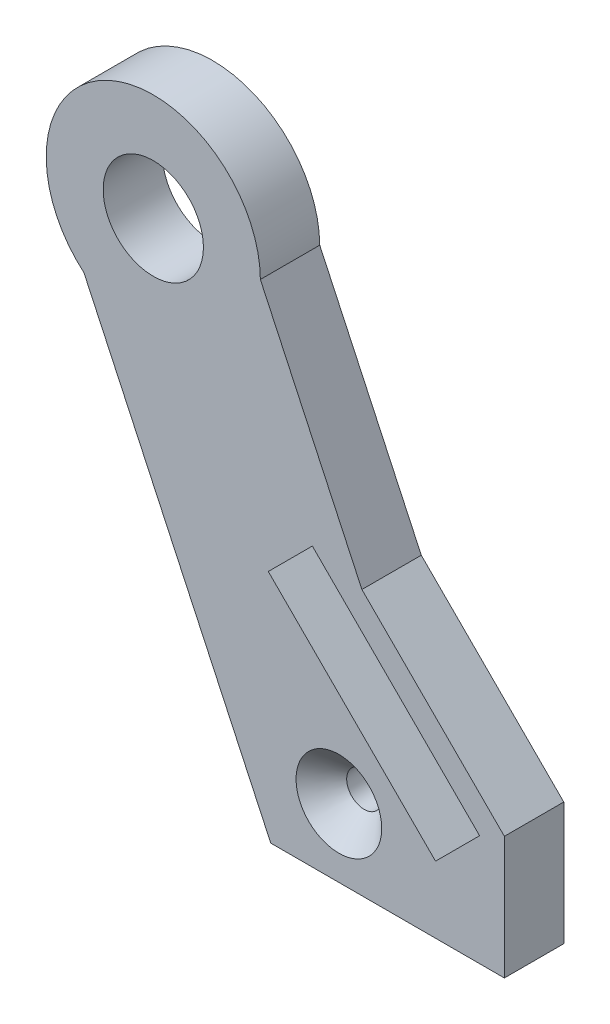
ISO-10303-21;
HEADER;
FILE_DESCRIPTION(('STEP AP214'),'2;1');
FILE_NAME('part.step','',(''),(''),'','','');
FILE_SCHEMA(('AUTOMOTIVE_DESIGN { 1 0 10303 214 1 1 1 1 }'));
ENDSEC;
DATA;
#1=APPLICATION_CONTEXT('core data for automotive mechanical design processes');
#2=APPLICATION_PROTOCOL_DEFINITION('international standard','automotive_design',2000,#1);
#3=PRODUCT_CONTEXT('',#1,'mechanical');
#4=PRODUCT('Part','Part','',(#3));
#5=PRODUCT_RELATED_PRODUCT_CATEGORY('part','',(#4));
#6=PRODUCT_DEFINITION_FORMATION('','',#4);
#7=PRODUCT_DEFINITION_CONTEXT('part definition',#1,'design');
#8=PRODUCT_DEFINITION('design','',#6,#7);
#9=PRODUCT_DEFINITION_SHAPE('','',#8);
#10=(LENGTH_UNIT() NAMED_UNIT(*) SI_UNIT(.MILLI.,.METRE.));
#11=(NAMED_UNIT(*) PLANE_ANGLE_UNIT() SI_UNIT($,.RADIAN.));
#12=(NAMED_UNIT(*) SI_UNIT($,.STERADIAN.) SOLID_ANGLE_UNIT());
#13=UNCERTAINTY_MEASURE_WITH_UNIT(LENGTH_MEASURE(1.E-05),#10,'distance_accuracy_value','');
#14=(GEOMETRIC_REPRESENTATION_CONTEXT(3) GLOBAL_UNCERTAINTY_ASSIGNED_CONTEXT((#13)) GLOBAL_UNIT_ASSIGNED_CONTEXT((#10,
#11,#12)) REPRESENTATION_CONTEXT('',''));
#15=CARTESIAN_POINT('',(0.,0.,0.));
#16=DIRECTION('',(0.,0.,1.));
#17=DIRECTION('',(1.,0.,0.));
#18=AXIS2_PLACEMENT_3D('',#15,#16,#17);
#19=CARTESIAN_POINT('',(3.5,3.5,3.05));
#20=DIRECTION('',(0.,0.,-1.));
#21=DIRECTION('',(-1.,0.,0.));
#22=AXIS2_PLACEMENT_3D('',#19,#20,#21);
#23=CYLINDRICAL_SURFACE('',#22,0.9);
#24=CARTESIAN_POINT('',(3.5,3.5,0.));
#25=DIRECTION('',(0.,0.,1.));
#26=DIRECTION('',(1.,0.,0.));
#27=AXIS2_PLACEMENT_3D('',#24,#25,#26);
#28=CIRCLE('',#27,0.9);
#29=CARTESIAN_POINT('',(4.4,3.5,0.));
#30=VERTEX_POINT('',#29);
#31=EDGE_CURVE('E167',#30,#30,#28,.T.);
#32=ORIENTED_EDGE('',*,*,#31,.F.);
#33=EDGE_LOOP('',(#32));
#34=FACE_BOUND('',#33,.T.);
#35=CARTESIAN_POINT('',(3.5,3.5,1.74999999999999));
#36=DIRECTION('',(0.,0.,1.));
#37=DIRECTION('',(1.,0.,0.));
#38=AXIS2_PLACEMENT_3D('',#35,#36,#37);
#39=CIRCLE('',#38,0.899999999999988);
#40=CARTESIAN_POINT('',(4.39999999999999,3.5,1.74999999999999));
#41=VERTEX_POINT('',#40);
#42=EDGE_CURVE('E172',#41,#41,#39,.T.);
#43=ORIENTED_EDGE('',*,*,#42,.T.);
#44=EDGE_LOOP('',(#43));
#45=FACE_BOUND('',#44,.T.);
#46=ADVANCED_FACE('F45',(#34,#45),#23,.F.);
#47=CARTESIAN_POINT('',(-6.03391760833418,24.7707859846198,3.05));
#48=DIRECTION('',(0.,0.,-1.));
#49=DIRECTION('',(-1.,0.,0.));
#50=AXIS2_PLACEMENT_3D('',#47,#48,#49);
#51=CYLINDRICAL_SURFACE('',#50,5.49999999999981);
#52=CARTESIAN_POINT('',(-6.03391760833418,24.7707859846198,0.));
#53=DIRECTION('',(0.,0.,1.));
#54=DIRECTION('',(1.,0.,0.));
#55=AXIS2_PLACEMENT_3D('',#52,#53,#54);
#56=CIRCLE('',#55,5.49999999999981);
#57=CARTESIAN_POINT('',(-0.534038585902411,24.8072652748118,0.));
#58=VERTEX_POINT('',#57);
#59=CARTESIAN_POINT('',(-9.59711645626916,20.5810826574052,0.));
#60=VERTEX_POINT('',#59);
#61=EDGE_CURVE('E188',#58,#60,#56,.T.);
#62=ORIENTED_EDGE('',*,*,#61,.T.);
#63=DIRECTION('',(0.,0.,-1.));
#64=VECTOR('',#63,1.);
#65=CARTESIAN_POINT('',(-9.59711645626916,20.5810826574052,3.05));
#66=LINE('',#65,#64);
#67=CARTESIAN_POINT('',(-9.59711645626916,20.5810826574052,3.05));
#68=VERTEX_POINT('',#67);
#69=EDGE_CURVE('E11',#68,#60,#66,.T.);
#70=ORIENTED_EDGE('',*,*,#69,.F.);
#71=CARTESIAN_POINT('',(-6.03391760833418,24.7707859846198,3.05));
#72=DIRECTION('',(0.,0.,1.));
#73=DIRECTION('',(1.,0.,0.));
#74=AXIS2_PLACEMENT_3D('',#71,#72,#73);
#75=CIRCLE('',#74,5.49999999999981);
#76=CARTESIAN_POINT('',(-0.534038585902411,24.8072652748118,3.05));
#77=VERTEX_POINT('',#76);
#78=EDGE_CURVE('E287',#77,#68,#75,.T.);
#79=ORIENTED_EDGE('',*,*,#78,.F.);
#80=DIRECTION('',(0.,0.,-1.));
#81=VECTOR('',#80,1.);
#82=CARTESIAN_POINT('',(-0.534038585902411,24.8072652748118,3.05));
#83=LINE('',#82,#81);
#84=EDGE_CURVE('E64',#77,#58,#83,.T.);
#85=ORIENTED_EDGE('',*,*,#84,.T.);
#86=EDGE_LOOP('',(#62,#70,#79,#85));
#87=FACE_BOUND('',#86,.T.);
#88=ADVANCED_FACE('F259',(#87),#51,.T.);
#89=CARTESIAN_POINT('',(0.,0.,3.05));
#90=DIRECTION('',(-0.906307787036648,-0.422618261740703,0.));
#91=DIRECTION('',(0.422618261740703,-0.906307787036648,0.));
#92=AXIS2_PLACEMENT_3D('',#89,#90,#91);
#93=PLANE('',#92);
#94=DIRECTION('',(-0.422618261740703,0.906307787036648,0.));
#95=VECTOR('',#94,1.);
#96=CARTESIAN_POINT('',(0.,0.,0.));
#97=LINE('',#96,#95);
#98=CARTESIAN_POINT('',(0.,0.,0.));
#99=VERTEX_POINT('',#98);
#100=EDGE_CURVE('E191',#99,#60,#97,.T.);
#101=ORIENTED_EDGE('',*,*,#100,.F.);
#102=DIRECTION('',(0.,0.,-1.));
#103=VECTOR('',#102,1.);
#104=CARTESIAN_POINT('',(0.,0.,3.05));
#105=LINE('',#104,#103);
#106=CARTESIAN_POINT('',(0.,0.,3.05));
#107=VERTEX_POINT('',#106);
#108=EDGE_CURVE('E55',#107,#99,#105,.T.);
#109=ORIENTED_EDGE('',*,*,#108,.F.);
#110=DIRECTION('',(-0.422618261740703,0.906307787036648,0.));
#111=VECTOR('',#110,1.);
#112=CARTESIAN_POINT('',(0.,0.,3.05));
#113=LINE('',#112,#111);
#114=EDGE_CURVE('E290',#107,#68,#113,.T.);
#115=ORIENTED_EDGE('',*,*,#114,.T.);
#116=ORIENTED_EDGE('',*,*,#69,.T.);
#117=EDGE_LOOP('',(#101,#109,#115,#116));
#118=FACE_BOUND('',#117,.T.);
#119=ADVANCED_FACE('F264',(#118),#93,.T.);
#120=CARTESIAN_POINT('',(0.,0.,3.05));
#121=DIRECTION('',(0.,1.,0.));
#122=DIRECTION('',(0.,0.,1.));
#123=AXIS2_PLACEMENT_3D('',#120,#121,#122);
#124=PLANE('',#123);
#125=DIRECTION('',(1.,0.,0.));
#126=VECTOR('',#125,1.);
#127=CARTESIAN_POINT('',(0.,0.,0.));
#128=LINE('',#127,#126);
#129=CARTESIAN_POINT('',(12.,0.,0.));
#130=VERTEX_POINT('',#129);
#131=EDGE_CURVE('E195',#99,#130,#128,.T.);
#132=ORIENTED_EDGE('',*,*,#131,.T.);
#133=DIRECTION('',(0.,0.,-1.));
#134=VECTOR('',#133,1.);
#135=CARTESIAN_POINT('',(12.,0.,3.05));
#136=LINE('',#135,#134);
#137=CARTESIAN_POINT('',(12.,0.,3.05));
#138=VERTEX_POINT('',#137);
#139=EDGE_CURVE('E152',#138,#130,#136,.T.);
#140=ORIENTED_EDGE('',*,*,#139,.F.);
#141=DIRECTION('',(1.,0.,0.));
#142=VECTOR('',#141,1.);
#143=CARTESIAN_POINT('',(0.,0.,3.05));
#144=LINE('',#143,#142);
#145=EDGE_CURVE('E138',#107,#138,#144,.T.);
#146=ORIENTED_EDGE('',*,*,#145,.F.);
#147=ORIENTED_EDGE('',*,*,#108,.T.);
#148=EDGE_LOOP('',(#132,#140,#146,#147));
#149=FACE_BOUND('',#148,.T.);
#150=ADVANCED_FACE('F300',(#149),#124,.F.);
#151=CARTESIAN_POINT('',(12.,0.,3.05));
#152=DIRECTION('',(-1.,0.,0.));
#153=DIRECTION('',(0.,0.,1.));
#154=AXIS2_PLACEMENT_3D('',#151,#152,#153);
#155=PLANE('',#154);
#156=DIRECTION('',(0.,1.,0.));
#157=VECTOR('',#156,1.);
#158=CARTESIAN_POINT('',(12.,0.,0.));
#159=LINE('',#158,#157);
#160=CARTESIAN_POINT('',(12.,6.3039086153561,0.));
#161=VERTEX_POINT('',#160);
#162=EDGE_CURVE('E148',#130,#161,#159,.T.);
#163=ORIENTED_EDGE('',*,*,#162,.T.);
#164=DIRECTION('',(0.,0.,-1.));
#165=VECTOR('',#164,1.);
#166=CARTESIAN_POINT('',(12.,6.3039086153561,3.05));
#167=LINE('',#166,#165);
#168=CARTESIAN_POINT('',(12.,6.3039086153561,3.05));
#169=VERTEX_POINT('',#168);
#170=EDGE_CURVE('E145',#169,#161,#167,.T.);
#171=ORIENTED_EDGE('',*,*,#170,.F.);
#172=DIRECTION('',(0.,1.,0.));
#173=VECTOR('',#172,1.);
#174=CARTESIAN_POINT('',(12.,0.,3.05));
#175=LINE('',#174,#173);
#176=EDGE_CURVE('E129',#138,#169,#175,.T.);
#177=ORIENTED_EDGE('',*,*,#176,.F.);
#178=ORIENTED_EDGE('',*,*,#139,.T.);
#179=EDGE_LOOP('',(#163,#171,#177,#178));
#180=FACE_BOUND('',#179,.T.);
#181=ADVANCED_FACE('F146',(#180),#155,.F.);
#182=CARTESIAN_POINT('',(9.15195430767813,9.15195430767801,3.05));
#183=DIRECTION('',(0.707106781186552,0.707106781186543,0.));
#184=DIRECTION('',(-0.707106781186543,0.707106781186552,0.));
#185=AXIS2_PLACEMENT_3D('',#182,#183,#184);
#186=PLANE('',#185);
#187=DIRECTION('',(0.707106781186543,-0.707106781186552,0.));
#188=VECTOR('',#187,1.);
#189=CARTESIAN_POINT('',(9.15195430767813,9.15195430767801,0.));
#190=LINE('',#189,#188);
#191=CARTESIAN_POINT('',(4.68158568563559,13.6223229297206,0.));
#192=VERTEX_POINT('',#191);
#193=EDGE_CURVE('E200',#192,#161,#190,.T.);
#194=ORIENTED_EDGE('',*,*,#193,.F.);
#195=DIRECTION('',(0.,0.,-1.));
#196=VECTOR('',#195,1.);
#197=CARTESIAN_POINT('',(4.68158568563559,13.6223229297206,3.05));
#198=LINE('',#197,#196);
#199=CARTESIAN_POINT('',(4.68158568563559,13.6223229297206,3.05));
#200=VERTEX_POINT('',#199);
#201=EDGE_CURVE('E95',#200,#192,#198,.T.);
#202=ORIENTED_EDGE('',*,*,#201,.F.);
#203=DIRECTION('',(0.707106781186543,-0.707106781186552,0.));
#204=VECTOR('',#203,1.);
#205=CARTESIAN_POINT('',(9.15195430767813,9.15195430767801,3.05));
#206=LINE('',#205,#204);
#207=EDGE_CURVE('E135',#200,#169,#206,.T.);
#208=ORIENTED_EDGE('',*,*,#207,.T.);
#209=ORIENTED_EDGE('',*,*,#170,.T.);
#210=EDGE_LOOP('',(#194,#202,#208,#209));
#211=FACE_BOUND('',#210,.T.);
#212=ADVANCED_FACE('F154',(#211),#186,.T.);
#213=CARTESIAN_POINT('',(2.51749910265625,-2.51749910265625,3.05));
#214=DIRECTION('',(-0.707106781186548,0.707106781186548,0.));
#215=DIRECTION('',(-0.707106781186548,-0.707106781186548,0.));
#216=AXIS2_PLACEMENT_3D('',#213,#214,#215);
#217=PLANE('',#216);
#218=DIRECTION('',(0.707106781186548,0.707106781186548,0.));
#219=VECTOR('',#218,1.);
#220=CARTESIAN_POINT('',(2.51749910265625,-2.51749910265625,0.));
#221=LINE('',#220,#219);
#222=CARTESIAN_POINT('',(8.46446609406726,3.42946788875476,0.));
#223=VERTEX_POINT('',#222);
#224=CARTESIAN_POINT('',(10.7272077938642,5.6922095885517,0.));
#225=VERTEX_POINT('',#224);
#226=EDGE_CURVE('E171',#223,#225,#221,.T.);
#227=ORIENTED_EDGE('',*,*,#226,.F.);
#228=DIRECTION('',(0.,0.,-1.));
#229=VECTOR('',#228,1.);
#230=CARTESIAN_POINT('',(8.46446609406726,3.42946788875476,3.05));
#231=LINE('',#230,#229);
#232=CARTESIAN_POINT('',(8.46446609406726,3.42946788875476,3.05));
#233=VERTEX_POINT('',#232);
#234=EDGE_CURVE('E48',#233,#223,#231,.T.);
#235=ORIENTED_EDGE('',*,*,#234,.F.);
#236=DIRECTION('',(0.707106781186548,0.707106781186548,0.));
#237=VECTOR('',#236,1.);
#238=CARTESIAN_POINT('',(2.51749910265625,-2.51749910265625,3.05));
#239=LINE('',#238,#237);
#240=CARTESIAN_POINT('',(10.7272077938642,5.6922095885517,3.05));
#241=VERTEX_POINT('',#240);
#242=EDGE_CURVE('E211',#233,#241,#239,.T.);
#243=ORIENTED_EDGE('',*,*,#242,.T.);
#244=DIRECTION('',(0.,0.,-1.));
#245=VECTOR('',#244,1.);
#246=CARTESIAN_POINT('',(10.7272077938642,5.6922095885517,3.05));
#247=LINE('',#246,#245);
#248=EDGE_CURVE('E166',#241,#225,#247,.T.);
#249=ORIENTED_EDGE('',*,*,#248,.T.);
#250=EDGE_LOOP('',(#227,#235,#243,#249));
#251=FACE_BOUND('',#250,.T.);
#252=ADVANCED_FACE('F240',(#251),#217,.T.);
#253=CARTESIAN_POINT('',(5.94696699141101,5.94696699141101,3.05));
#254=DIRECTION('',(-0.707106781186547,-0.707106781186548,0.));
#255=DIRECTION('',(0.707106781186548,-0.707106781186547,0.));
#256=AXIS2_PLACEMENT_3D('',#253,#254,#255);
#257=PLANE('',#256);
#258=DIRECTION('',(-0.707106781186548,0.707106781186547,0.));
#259=VECTOR('',#258,1.);
#260=CARTESIAN_POINT('',(5.94696699141101,5.94696699141101,0.));
#261=LINE('',#260,#259);
#262=CARTESIAN_POINT('',(-0.126881297349292,12.0208152801713,0.));
#263=VERTEX_POINT('',#262);
#264=EDGE_CURVE('E176',#223,#263,#261,.T.);
#265=ORIENTED_EDGE('',*,*,#264,.T.);
#266=DIRECTION('',(0.,0.,-1.));
#267=VECTOR('',#266,1.);
#268=CARTESIAN_POINT('',(-0.126881297349292,12.0208152801713,3.05));
#269=LINE('',#268,#267);
#270=CARTESIAN_POINT('',(-0.126881297349292,12.0208152801713,3.05));
#271=VERTEX_POINT('',#270);
#272=EDGE_CURVE('E225',#271,#263,#269,.T.);
#273=ORIENTED_EDGE('',*,*,#272,.F.);
#274=DIRECTION('',(-0.707106781186548,0.707106781186547,0.));
#275=VECTOR('',#274,1.);
#276=CARTESIAN_POINT('',(5.94696699141101,5.94696699141101,3.05));
#277=LINE('',#276,#275);
#278=EDGE_CURVE('E235',#233,#271,#277,.T.);
#279=ORIENTED_EDGE('',*,*,#278,.F.);
#280=ORIENTED_EDGE('',*,*,#234,.T.);
#281=EDGE_LOOP('',(#265,#273,#279,#280));
#282=FACE_BOUND('',#281,.T.);
#283=ADVANCED_FACE('F233',(#282),#257,.F.);
#284=CARTESIAN_POINT('',(-6.0738482887603,6.0738482887603,3.05));
#285=DIRECTION('',(-0.707106781186547,0.707106781186548,0.));
#286=DIRECTION('',(-0.707106781186548,-0.707106781186547,0.));
#287=AXIS2_PLACEMENT_3D('',#284,#285,#286);
#288=PLANE('',#287);
#289=DIRECTION('',(0.707106781186548,0.707106781186547,0.));
#290=VECTOR('',#289,1.);
#291=CARTESIAN_POINT('',(-6.0738482887603,6.0738482887603,0.));
#292=LINE('',#291,#290);
#293=CARTESIAN_POINT('',(2.13586040244766,14.2835569799683,0.));
#294=VERTEX_POINT('',#293);
#295=EDGE_CURVE('E180',#263,#294,#292,.T.);
#296=ORIENTED_EDGE('',*,*,#295,.T.);
#297=DIRECTION('',(0.,0.,-1.));
#298=VECTOR('',#297,1.);
#299=CARTESIAN_POINT('',(2.13586040244766,14.2835569799683,3.05));
#300=LINE('',#299,#298);
#301=CARTESIAN_POINT('',(2.13586040244766,14.2835569799683,3.05));
#302=VERTEX_POINT('',#301);
#303=EDGE_CURVE('E222',#302,#294,#300,.T.);
#304=ORIENTED_EDGE('',*,*,#303,.F.);
#305=DIRECTION('',(0.707106781186548,0.707106781186547,0.));
#306=VECTOR('',#305,1.);
#307=CARTESIAN_POINT('',(-6.0738482887603,6.0738482887603,3.05));
#308=LINE('',#307,#306);
#309=EDGE_CURVE('E282',#271,#302,#308,.T.);
#310=ORIENTED_EDGE('',*,*,#309,.F.);
#311=ORIENTED_EDGE('',*,*,#272,.T.);
#312=EDGE_LOOP('',(#296,#304,#310,#311));
#313=FACE_BOUND('',#312,.T.);
#314=ADVANCED_FACE('F247',(#313),#288,.F.);
#315=CARTESIAN_POINT('',(9.0630778703663,4.22618261740677,3.05));
#316=DIRECTION('',(0.906307787036655,0.422618261740689,0.));
#317=DIRECTION('',(-0.422618261740689,0.906307787036655,0.));
#318=AXIS2_PLACEMENT_3D('',#315,#316,#317);
#319=PLANE('',#318);
#320=DIRECTION('',(0.422618261740689,-0.906307787036655,0.));
#321=VECTOR('',#320,1.);
#322=CARTESIAN_POINT('',(9.0630778703663,4.22618261740677,0.));
#323=LINE('',#322,#321);
#324=EDGE_CURVE('E203',#58,#192,#323,.T.);
#325=ORIENTED_EDGE('',*,*,#324,.F.);
#326=ORIENTED_EDGE('',*,*,#84,.F.);
#327=DIRECTION('',(0.422618261740689,-0.906307787036655,0.));
#328=VECTOR('',#327,1.);
#329=CARTESIAN_POINT('',(9.0630778703663,4.22618261740677,3.05));
#330=LINE('',#329,#328);
#331=EDGE_CURVE('E156',#77,#200,#330,.T.);
#332=ORIENTED_EDGE('',*,*,#331,.T.);
#333=ORIENTED_EDGE('',*,*,#201,.T.);
#334=EDGE_LOOP('',(#325,#326,#332,#333));
#335=FACE_BOUND('',#334,.T.);
#336=ADVANCED_FACE('F249',(#335),#319,.T.);
#337=CARTESIAN_POINT('',(8.20970869120796,8.20970869120796,3.05));
#338=DIRECTION('',(0.707106781186548,0.707106781186548,0.));
#339=DIRECTION('',(-0.707106781186548,0.707106781186548,0.));
#340=AXIS2_PLACEMENT_3D('',#337,#338,#339);
#341=PLANE('',#340);
#342=DIRECTION('',(0.707106781186548,-0.707106781186548,0.));
#343=VECTOR('',#342,1.);
#344=CARTESIAN_POINT('',(8.20970869120796,8.20970869120796,0.));
#345=LINE('',#344,#343);
#346=EDGE_CURVE('E184',#294,#225,#345,.T.);
#347=ORIENTED_EDGE('',*,*,#346,.T.);
#348=ORIENTED_EDGE('',*,*,#248,.F.);
#349=DIRECTION('',(0.707106781186548,-0.707106781186548,0.));
#350=VECTOR('',#349,1.);
#351=CARTESIAN_POINT('',(8.20970869120796,8.20970869120796,3.05));
#352=LINE('',#351,#350);
#353=EDGE_CURVE('E245',#302,#241,#352,.T.);
#354=ORIENTED_EDGE('',*,*,#353,.F.);
#355=ORIENTED_EDGE('',*,*,#303,.T.);
#356=EDGE_LOOP('',(#347,#348,#354,#355));
#357=FACE_BOUND('',#356,.T.);
#358=ADVANCED_FACE('F243',(#357),#341,.F.);
#359=CARTESIAN_POINT('',(-6.03391760833418,24.7707859846198,3.05));
#360=DIRECTION('',(0.,0.,-1.));
#361=DIRECTION('',(-1.,0.,0.));
#362=AXIS2_PLACEMENT_3D('',#359,#360,#361);
#363=CYLINDRICAL_SURFACE('',#362,2.57499999999981);
#364=CARTESIAN_POINT('',(-6.03391760833418,24.7707859846198,3.05));
#365=DIRECTION('',(0.,0.,1.));
#366=DIRECTION('',(1.,0.,0.));
#367=AXIS2_PLACEMENT_3D('',#364,#365,#366);
#368=CIRCLE('',#367,2.57499999999981);
#369=CARTESIAN_POINT('',(-3.45891760833437,24.7707859846198,3.05));
#370=VERTEX_POINT('',#369);
#371=EDGE_CURVE('E159',#370,#370,#368,.T.);
#372=ORIENTED_EDGE('',*,*,#371,.T.);
#373=EDGE_LOOP('',(#372));
#374=FACE_BOUND('',#373,.T.);
#375=CARTESIAN_POINT('',(-6.03391760833418,24.7707859846198,0.));
#376=DIRECTION('',(0.,0.,1.));
#377=DIRECTION('',(1.,0.,0.));
#378=AXIS2_PLACEMENT_3D('',#375,#376,#377);
#379=CIRCLE('',#378,2.57499999999981);
#380=CARTESIAN_POINT('',(-3.45891760833437,24.7707859846198,0.));
#381=VERTEX_POINT('',#380);
#382=EDGE_CURVE('E207',#381,#381,#379,.T.);
#383=ORIENTED_EDGE('',*,*,#382,.F.);
#384=EDGE_LOOP('',(#383));
#385=FACE_BOUND('',#384,.T.);
#386=ADVANCED_FACE('F311',(#374,#385),#363,.F.);
#387=CARTESIAN_POINT('',(0.,0.,3.05));
#388=DIRECTION('',(0.,0.,1.));
#389=DIRECTION('',(1.,0.,0.));
#390=AXIS2_PLACEMENT_3D('',#387,#388,#389);
#391=PLANE('',#390);
#392=CARTESIAN_POINT('',(3.5,3.5,3.05));
#393=DIRECTION('',(0.,0.,1.));
#394=DIRECTION('',(1.,0.,0.));
#395=AXIS2_PLACEMENT_3D('',#392,#393,#394);
#396=CIRCLE('',#395,2.2);
#397=CARTESIAN_POINT('',(5.7,3.5,3.05));
#398=VERTEX_POINT('',#397);
#399=EDGE_CURVE('E272',#398,#398,#396,.T.);
#400=ORIENTED_EDGE('',*,*,#399,.F.);
#401=EDGE_LOOP('',(#400));
#402=FACE_BOUND('',#401,.T.);
#403=ORIENTED_EDGE('',*,*,#242,.F.);
#404=ORIENTED_EDGE('',*,*,#278,.T.);
#405=ORIENTED_EDGE('',*,*,#309,.T.);
#406=ORIENTED_EDGE('',*,*,#353,.T.);
#407=EDGE_LOOP('',(#403,#404,#405,#406));
#408=FACE_BOUND('',#407,.T.);
#409=ORIENTED_EDGE('',*,*,#78,.T.);
#410=ORIENTED_EDGE('',*,*,#114,.F.);
#411=ORIENTED_EDGE('',*,*,#145,.T.);
#412=ORIENTED_EDGE('',*,*,#176,.T.);
#413=ORIENTED_EDGE('',*,*,#207,.F.);
#414=ORIENTED_EDGE('',*,*,#331,.F.);
#415=EDGE_LOOP('',(#409,#410,#411,#412,#413,#414));
#416=FACE_BOUND('',#415,.T.);
#417=ORIENTED_EDGE('',*,*,#371,.F.);
#418=EDGE_LOOP('',(#417));
#419=FACE_BOUND('',#418,.T.);
#420=ADVANCED_FACE('F131',(#402,#408,#416,#419),#391,.T.);
#421=CARTESIAN_POINT('',(0.,0.,0.));
#422=DIRECTION('',(0.,0.,1.));
#423=DIRECTION('',(1.,0.,0.));
#424=AXIS2_PLACEMENT_3D('',#421,#422,#423);
#425=PLANE('',#424);
#426=ORIENTED_EDGE('',*,*,#31,.T.);
#427=EDGE_LOOP('',(#426));
#428=FACE_BOUND('',#427,.T.);
#429=ORIENTED_EDGE('',*,*,#226,.T.);
#430=ORIENTED_EDGE('',*,*,#346,.F.);
#431=ORIENTED_EDGE('',*,*,#295,.F.);
#432=ORIENTED_EDGE('',*,*,#264,.F.);
#433=EDGE_LOOP('',(#429,#430,#431,#432));
#434=FACE_BOUND('',#433,.T.);
#435=ORIENTED_EDGE('',*,*,#61,.F.);
#436=ORIENTED_EDGE('',*,*,#324,.T.);
#437=ORIENTED_EDGE('',*,*,#193,.T.);
#438=ORIENTED_EDGE('',*,*,#162,.F.);
#439=ORIENTED_EDGE('',*,*,#131,.F.);
#440=ORIENTED_EDGE('',*,*,#100,.T.);
#441=EDGE_LOOP('',(#435,#436,#437,#438,#439,#440));
#442=FACE_BOUND('',#441,.T.);
#443=ORIENTED_EDGE('',*,*,#382,.T.);
#444=EDGE_LOOP('',(#443));
#445=FACE_BOUND('',#444,.T.);
#446=ADVANCED_FACE('F238',(#428,#434,#442,#445),#425,.F.);
#447=CARTESIAN_POINT('',(3.5,3.5,3.05));
#448=DIRECTION('',(0.,0.,1.));
#449=DIRECTION('',(1.,0.,0.));
#450=AXIS2_PLACEMENT_3D('',#447,#448,#449);
#451=CONICAL_SURFACE('',#450,2.2,0.785398163397449);
#452=ORIENTED_EDGE('',*,*,#42,.F.);
#453=EDGE_LOOP('',(#452));
#454=FACE_BOUND('',#453,.T.);
#455=ORIENTED_EDGE('',*,*,#399,.T.);
#456=EDGE_LOOP('',(#455));
#457=FACE_BOUND('',#456,.T.);
#458=ADVANCED_FACE('F366',(#454,#457),#451,.F.);
#459=CLOSED_SHELL('',(#46,#88,#119,#150,#181,#212,#252,#283,#314,#336,#358,#386,#420,#446,#458));
#460=MANIFOLD_SOLID_BREP('B2',#459);
#461=ADVANCED_BREP_SHAPE_REPRESENTATION('',(#18,#460),#14);
#462=SHAPE_DEFINITION_REPRESENTATION(#9,#461);
ENDSEC;
END-ISO-10303-21;
